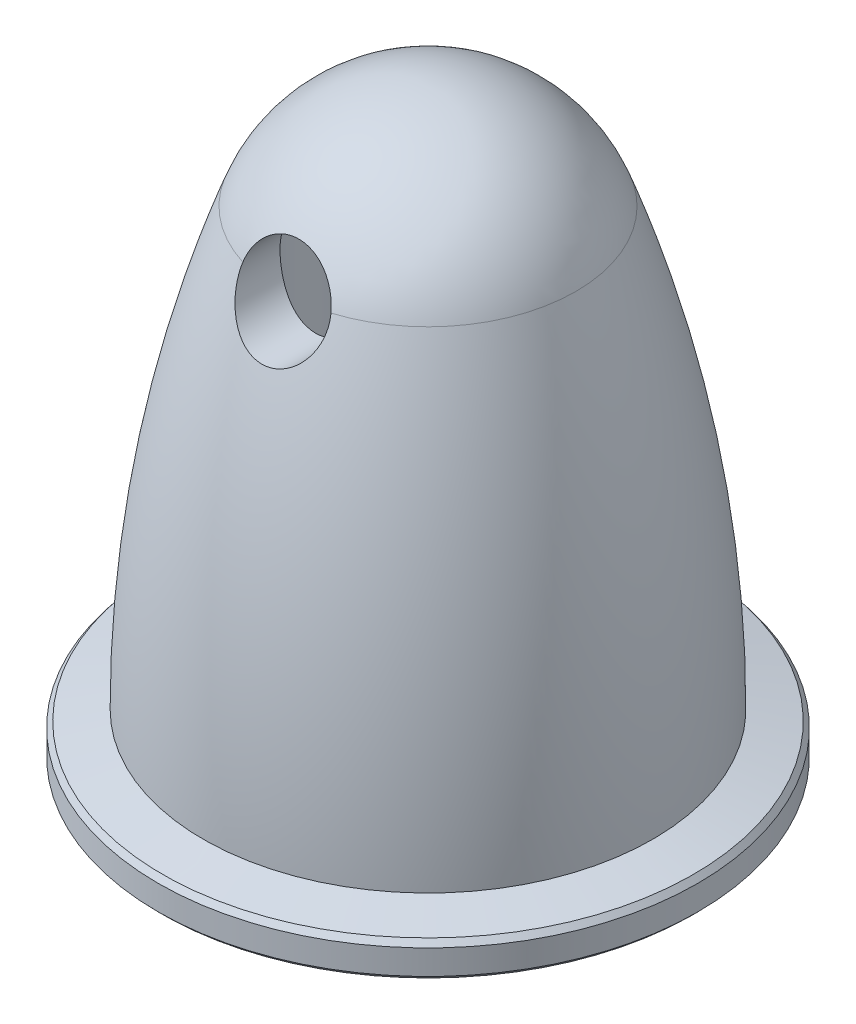
ISO-10303-21;
HEADER;
FILE_DESCRIPTION(('STEP AP214'),'2;1');
FILE_NAME('part.step','',(''),(''),'','','');
FILE_SCHEMA(('AUTOMOTIVE_DESIGN { 1 0 10303 214 1 1 1 1 }'));
ENDSEC;
DATA;
#1=APPLICATION_CONTEXT('core data for automotive mechanical design processes');
#2=APPLICATION_PROTOCOL_DEFINITION('international standard','automotive_design',2000,#1);
#3=PRODUCT_CONTEXT('',#1,'mechanical');
#4=PRODUCT('Part','Part','',(#3));
#5=PRODUCT_RELATED_PRODUCT_CATEGORY('part','',(#4));
#6=PRODUCT_DEFINITION_FORMATION('','',#4);
#7=PRODUCT_DEFINITION_CONTEXT('part definition',#1,'design');
#8=PRODUCT_DEFINITION('design','',#6,#7);
#9=PRODUCT_DEFINITION_SHAPE('','',#8);
#10=(LENGTH_UNIT() NAMED_UNIT(*) SI_UNIT(.MILLI.,.METRE.));
#11=(NAMED_UNIT(*) PLANE_ANGLE_UNIT() SI_UNIT($,.RADIAN.));
#12=(NAMED_UNIT(*) SI_UNIT($,.STERADIAN.) SOLID_ANGLE_UNIT());
#13=UNCERTAINTY_MEASURE_WITH_UNIT(LENGTH_MEASURE(1.E-05),#10,'distance_accuracy_value','');
#14=(GEOMETRIC_REPRESENTATION_CONTEXT(3) GLOBAL_UNCERTAINTY_ASSIGNED_CONTEXT((#13)) GLOBAL_UNIT_ASSIGNED_CONTEXT((#10,
#11,#12)) REPRESENTATION_CONTEXT('',''));
#15=CARTESIAN_POINT('',(0.,0.,0.));
#16=DIRECTION('',(0.,0.,1.));
#17=DIRECTION('',(1.,0.,0.));
#18=AXIS2_PLACEMENT_3D('',#15,#16,#17);
#19=CARTESIAN_POINT('',(0.,1.,0.));
#20=DIRECTION('',(0.,-1.,0.));
#21=DIRECTION('',(0.,0.,-1.));
#22=AXIS2_PLACEMENT_3D('',#19,#20,#21);
#23=DEGENERATE_TOROIDAL_SURFACE('',#22,23.3333333333333,28.3333333333333,.F.);
#24=CARTESIAN_POINT('',(-0.9801643130747,10.6981865771812,-3.13904872299698));
#25=CARTESIAN_POINT('',(-0.992082165864464,10.6393453095916,-3.15773856038258));
#26=CARTESIAN_POINT('',(-0.998537567377883,10.5800705783703,-3.17814365135362));
#27=CARTESIAN_POINT('',(-1.00101183025111,10.4623832107852,-3.22138447880564));
#28=CARTESIAN_POINT('',(-0.997062775937913,10.4039684814241,-3.24421253507635));
#29=CARTESIAN_POINT('',(-0.979300057147627,10.2894537358907,-3.29138277254803));
#30=CARTESIAN_POINT('',(-0.965504494016743,10.2333496717876,-3.31572210064782));
#31=CARTESIAN_POINT('',(-0.92859587113452,10.1244791589299,-3.36493771689045));
#32=CARTESIAN_POINT('',(-0.905473286191802,10.0717161861802,-3.3898145292822));
#33=CARTESIAN_POINT('',(-0.848796493965392,9.96778986336193,-3.4404285157489));
#34=CARTESIAN_POINT('',(-0.814716343697065,9.91689548640334,-3.46613224584871));
#35=CARTESIAN_POINT('',(-0.737244865027408,9.82159097549659,-3.51553138460037));
#36=CARTESIAN_POINT('',(-0.693853927341564,9.77718056958812,-3.53922687746718));
#37=CARTESIAN_POINT('',(-0.599948412864383,9.69767057976324,-3.58246029288749));
#38=CARTESIAN_POINT('',(-0.549684096683314,9.66233335390124,-3.60210091096532));
#39=CARTESIAN_POINT('',(-0.442281198488128,9.60100177310645,-3.63661477246273));
#40=CARTESIAN_POINT('',(-0.385150971545725,9.57499621318231,-3.65149373110302));
#41=CARTESIAN_POINT('',(-0.273455339507679,9.53653861089263,-3.67364756047944));
#42=CARTESIAN_POINT('',(-0.219481484087649,9.52278714885107,-3.6816468280469));
#43=CARTESIAN_POINT('',(-0.10949797326955,9.50445525575651,-3.69233154444194));
#44=CARTESIAN_POINT('',(-0.0534901363723631,9.4998668283909,-3.69502162641661));
#45=CARTESIAN_POINT('',(0.0521181623852736,9.50012390862014,-3.69487183584818));
#46=CARTESIAN_POINT('',(0.101725781564948,9.5039596772191,-3.69262384315565));
#47=CARTESIAN_POINT('',(0.199459809903802,9.51884856686669,-3.68393993456397));
#48=CARTESIAN_POINT('',(0.247586314733544,9.52990122072152,-3.67750428975763));
#49=CARTESIAN_POINT('',(0.340744503028943,9.55858970405548,-3.66092924089532));
#50=CARTESIAN_POINT('',(0.385796155320421,9.57617705279279,-3.65081712408367));
#51=CARTESIAN_POINT('',(0.472246611794564,9.61723428040891,-3.6274620630342));
#52=CARTESIAN_POINT('',(0.513644350397718,9.64070586767647,-3.61421820961331));
#53=CARTESIAN_POINT('',(0.595682950729986,9.69513929849346,-3.58392450392749));
#54=CARTESIAN_POINT('',(0.635912056839517,9.72658841243753,-3.56663796715277));
#55=CARTESIAN_POINT('',(0.710636979024403,9.79462637774685,-3.52994426889806));
#56=CARTESIAN_POINT('',(0.74513018682927,9.83121755347068,-3.51053614928825));
#57=CARTESIAN_POINT('',(0.812014566294821,9.91365658731909,-3.46781736674034));
#58=CARTESIAN_POINT('',(0.843569676997206,9.96008977105201,-3.44432534306232));
#59=CARTESIAN_POINT('',(0.89842920163067,10.0573422100791,-3.39670167569315));
#60=CARTESIAN_POINT('',(0.92172606775987,10.1081654252558,-3.37256946842908));
#61=CARTESIAN_POINT('',(0.961257636411987,10.2177452859143,-3.32257616368589));
#62=CARTESIAN_POINT('',(0.976694745072119,10.276806879585,-3.29674883916485));
#63=CARTESIAN_POINT('',(0.996588928143539,10.3973839989778,-3.24679229374132));
#64=CARTESIAN_POINT('',(1.00106556872487,10.4588949523462,-3.22266012166442));
#65=CARTESIAN_POINT('',(0.999172674042205,10.5503053501794,-3.1890827993519));
#66=CARTESIAN_POINT('',(0.997244884244495,10.5799460196496,-3.17854640702062));
#67=CARTESIAN_POINT('',(0.990717053181848,10.6391597508737,-3.15821899542592));
#68=CARTESIAN_POINT('',(0.98611923310514,10.6687328483357,-3.14842736424677));
#69=CARTESIAN_POINT('',(0.9801643130747,10.6981865771812,-3.13904872299697));
#70=B_SPLINE_CURVE_WITH_KNOTS('',3,(#24,#25,#26,#27,#28,#29,#30,#31,#32,#33,#34,#35,#36,#37,#38,
#39,#40,#41,#42,#43,#44,#45,#46,#47,#48,#49,#50,#51,#52,#53,#54,#55,#56,#57,#58,#59,#60,#61,#62,
#63,#64,#65,#66,#67,#68,#69),.UNSPECIFIED.,.F.,.F.,(4,2,2,2,2,2,2,2,2,2,2,2,2,2,2,2,2,2,2,2,2,2,
4),(0.,0.188207080940665,0.375834465574143,0.563117810558757,0.750592904263904,
0.948909956489771,1.14721868821684,1.33962919300086,1.53180788173466,1.69964709417016,
1.86733977411173,2.01603736218547,2.16472532509534,2.3123315131729,2.45998060593227,
2.62106692627656,2.78222629786698,2.96404152689865,3.14602250403153,3.34394785240539,
3.54151961425232,3.63596357007722,3.73032907065004),.UNSPECIFIED.);
#71=CARTESIAN_POINT('',(-0.980204731296514,10.6979865771812,-3.13911242959496));
#72=VERTEX_POINT('',#71);
#73=CARTESIAN_POINT('',(0.980204731296514,10.6979865771812,-3.13911242959496));
#74=VERTEX_POINT('',#73);
#75=EDGE_CURVE('E45',#72,#74,#70,.T.);
#76=ORIENTED_EDGE('',*,*,#75,.T.);
#77=CARTESIAN_POINT('',(0.,10.6979865771812,0.));
#78=DIRECTION('',(0.,-1.,0.));
#79=DIRECTION('',(0.,0.,-1.));
#80=AXIS2_PLACEMENT_3D('',#77,#78,#79);
#81=CIRCLE('',#80,3.28859060402684);
#82=CARTESIAN_POINT('',(0.980204731296514,10.6979865771812,3.13911242959496));
#83=VERTEX_POINT('',#82);
#84=EDGE_CURVE('E39',#74,#83,#81,.T.);
#85=ORIENTED_EDGE('',*,*,#84,.T.);
#86=CARTESIAN_POINT('',(-0.980164313074701,10.6981865771812,3.13904872299698));
#87=CARTESIAN_POINT('',(-0.992082165864465,10.6393453095916,3.15773856038258));
#88=CARTESIAN_POINT('',(-0.998537567377884,10.5800705783703,3.17814365135362));
#89=CARTESIAN_POINT('',(-1.00101183025111,10.4623832107852,3.22138447880564));
#90=CARTESIAN_POINT('',(-0.997062775937913,10.4039684814241,3.24421253507635));
#91=CARTESIAN_POINT('',(-0.979300057147626,10.2894537358907,3.29138277254803));
#92=CARTESIAN_POINT('',(-0.965504494016743,10.2333496717876,3.31572210064782));
#93=CARTESIAN_POINT('',(-0.928595871134519,10.1244791589299,3.36493771689045));
#94=CARTESIAN_POINT('',(-0.9054732861918,10.0717161861802,3.38981452928219));
#95=CARTESIAN_POINT('',(-0.848796493965389,9.96778986336192,3.4404285157489));
#96=CARTESIAN_POINT('',(-0.814716343697063,9.91689548640333,3.46613224584871));
#97=CARTESIAN_POINT('',(-0.737244865027407,9.82159097549659,3.51553138460037));
#98=CARTESIAN_POINT('',(-0.693853927341563,9.77718056958812,3.53922687746718));
#99=CARTESIAN_POINT('',(-0.599948412864381,9.69767057976324,3.5824602928875));
#100=CARTESIAN_POINT('',(-0.549684096683312,9.66233335390124,3.60210091096532));
#101=CARTESIAN_POINT('',(-0.442281198488124,9.60100177310644,3.63661477246273));
#102=CARTESIAN_POINT('',(-0.385150971545721,9.57499621318231,3.65149373110302));
#103=CARTESIAN_POINT('',(-0.273455339507675,9.53653861089263,3.67364756047944));
#104=CARTESIAN_POINT('',(-0.219481484087644,9.52278714885107,3.6816468280469));
#105=CARTESIAN_POINT('',(-0.109497973269545,9.50445525575651,3.69233154444194));
#106=CARTESIAN_POINT('',(-0.0534901363723588,9.4998668283909,3.69502162641661));
#107=CARTESIAN_POINT('',(0.0521181623852778,9.50012390862014,3.69487183584818));
#108=CARTESIAN_POINT('',(0.101725781564953,9.5039596772191,3.69262384315565));
#109=CARTESIAN_POINT('',(0.199459809903807,9.51884856686669,3.68393993456397));
#110=CARTESIAN_POINT('',(0.247586314733548,9.52990122072153,3.67750428975762));
#111=CARTESIAN_POINT('',(0.340744503028946,9.55858970405548,3.66092924089531));
#112=CARTESIAN_POINT('',(0.385796155320424,9.57617705279279,3.65081712408367));
#113=CARTESIAN_POINT('',(0.472246611794567,9.61723428040892,3.6274620630342));
#114=CARTESIAN_POINT('',(0.513644350397721,9.64070586767647,3.61421820961331));
#115=CARTESIAN_POINT('',(0.595682950729989,9.69513929849346,3.5839245039275));
#116=CARTESIAN_POINT('',(0.63591205683952,9.72658841243754,3.56663796715278));
#117=CARTESIAN_POINT('',(0.710636979024406,9.79462637774685,3.52994426889806));
#118=CARTESIAN_POINT('',(0.745130186829273,9.83121755347069,3.51053614928825));
#119=CARTESIAN_POINT('',(0.812014566294823,9.9136565873191,3.46781736674034));
#120=CARTESIAN_POINT('',(0.843569676997208,9.96008977105202,3.44432534306232));
#121=CARTESIAN_POINT('',(0.898429201630672,10.0573422100792,3.39670167569315));
#122=CARTESIAN_POINT('',(0.921726067759872,10.1081654252558,3.37256946842908));
#123=CARTESIAN_POINT('',(0.961257636411988,10.2177452859143,3.32257616368589));
#124=CARTESIAN_POINT('',(0.97669474507212,10.276806879585,3.29674883916485));
#125=CARTESIAN_POINT('',(0.996588928143539,10.3973839989778,3.24679229374132));
#126=CARTESIAN_POINT('',(1.00106556872487,10.4588949523462,3.22266012166441));
#127=CARTESIAN_POINT('',(0.999172674042205,10.5503053501794,3.18908279935189));
#128=CARTESIAN_POINT('',(0.997244884244495,10.5799460196496,3.17854640702062));
#129=CARTESIAN_POINT('',(0.990717053181848,10.6391597508737,3.15821899542592));
#130=CARTESIAN_POINT('',(0.98611923310514,10.6687328483357,3.14842736424677));
#131=CARTESIAN_POINT('',(0.980164313074701,10.6981865771812,3.13904872299698));
#132=B_SPLINE_CURVE_WITH_KNOTS('',3,(#86,#87,#88,#89,#90,#91,#92,#93,#94,#95,#96,#97,#98,#99,
#100,#101,#102,#103,#104,#105,#106,#107,#108,#109,#110,#111,#112,#113,#114,#115,#116,#117,#118,
#119,#120,#121,#122,#123,#124,#125,#126,#127,#128,#129,#130,#131),.UNSPECIFIED.,.F.,.F.,(4,2,2,
2,2,2,2,2,2,2,2,2,2,2,2,2,2,2,2,2,2,2,4),(0.,0.188207080940667,0.375834465574145,
0.563117810558758,0.750592904263907,0.948909956489771,1.14721868821684,1.33962919300087,
1.53180788173467,1.69964709417017,1.86733977411174,2.01603736218548,2.16472532509535,
2.3123315131729,2.45998060593227,2.62106692627657,2.78222629786698,2.96404152689866,
3.14602250403153,3.34394785240539,3.54151961425232,3.63596357007722,3.73032907065004),.UNSPECIFIED.);
#133=CARTESIAN_POINT('',(-0.980204731296514,10.6979865771812,3.13911242959496));
#134=VERTEX_POINT('',#133);
#135=EDGE_CURVE('E114',#134,#83,#132,.T.);
#136=ORIENTED_EDGE('',*,*,#135,.F.);
#137=EDGE_CURVE('E11',#134,#72,#81,.T.);
#138=ORIENTED_EDGE('',*,*,#137,.T.);
#139=EDGE_LOOP('',(#76,#85,#136,#138));
#140=FACE_BOUND('',#139,.T.);
#141=CARTESIAN_POINT('',(0.,1.,0.));
#142=DIRECTION('',(0.,-1.,0.));
#143=DIRECTION('',(0.,0.,-1.));
#144=AXIS2_PLACEMENT_3D('',#141,#142,#143);
#145=CIRCLE('',#144,5.);
#146=CARTESIAN_POINT('',(0.,1.,-5.));
#147=VERTEX_POINT('',#146);
#148=EDGE_CURVE('E111',#147,#147,#145,.T.);
#149=ORIENTED_EDGE('',*,*,#148,.F.);
#150=EDGE_LOOP('',(#149));
#151=FACE_BOUND('',#150,.T.);
#152=ADVANCED_FACE('F32',(#140,#151),#23,.F.);
#153=CARTESIAN_POINT('',(0.,9.5,0.));
#154=DIRECTION('',(0.,-1.,0.));
#155=DIRECTION('',(1.,0.,0.));
#156=AXIS2_PLACEMENT_3D('',#153,#154,#155);
#157=SPHERICAL_SURFACE('',#156,3.5);
#158=CARTESIAN_POINT('',(0.980245107045654,10.6977865771812,-3.13917614122521));
#159=CARTESIAN_POINT('',(0.968852237943741,10.7544386248826,-3.12113558879562));
#160=CARTESIAN_POINT('',(0.952466895786107,10.8101391899172,-3.10323025675369));
#161=CARTESIAN_POINT('',(0.910210813513384,10.9181682376535,-3.06821773098663));
#162=CARTESIAN_POINT('',(0.884328694539177,10.9704925862333,-3.05111152259002));
#163=CARTESIAN_POINT('',(0.823572665724106,11.0702153261289,-3.01825157067155));
#164=CARTESIAN_POINT('',(0.788688175741504,11.1176078286414,-3.00249944779192));
#165=CARTESIAN_POINT('',(0.710800478458026,11.205847415003,-2.97296530619078));
#166=CARTESIAN_POINT('',(0.667803407358088,11.2466994030786,-2.95918181219142));
#167=CARTESIAN_POINT('',(0.576251079189582,11.3192928793724,-2.93454629271452));
#168=CARTESIAN_POINT('',(0.527910969623835,11.3512787503073,-2.92361625373635));
#169=CARTESIAN_POINT('',(0.425976835832818,11.4065887234717,-2.90463649566655));
#170=CARTESIAN_POINT('',(0.37238350153275,11.4299139612123,-2.89658639898556));
#171=CARTESIAN_POINT('',(0.26456655234168,11.4659510771048,-2.88411770409719));
#172=CARTESIAN_POINT('',(0.210530020907756,11.4791639638708,-2.87952787694232));
#173=CARTESIAN_POINT('',(0.100849817250007,11.4964479914392,-2.87351933239727));
#174=CARTESIAN_POINT('',(0.0452066957480957,11.5005222280598,-2.87209954112337));
#175=CARTESIAN_POINT('',(-0.0638371764819372,11.4993920951091,-2.87249293544999));
#176=CARTESIAN_POINT('',(-0.11724237911833,11.4945362675807,-2.87418467761866));
#177=CARTESIAN_POINT('',(-0.22242388737002,11.4764094007266,-2.88048449917688));
#178=CARTESIAN_POINT('',(-0.274200213513293,11.4631384674972,-2.88509254179817));
#179=CARTESIAN_POINT('',(-0.374670662307187,11.4286772176777,-2.89701237421307));
#180=CARTESIAN_POINT('',(-0.423366644051968,11.4074917321602,-2.90432251460725));
#181=CARTESIAN_POINT('',(-0.516477726976704,11.3579239578044,-2.92133944316426));
#182=CARTESIAN_POINT('',(-0.560892591043462,11.3295412706589,-2.93104636396882));
#183=CARTESIAN_POINT('',(-0.645896182967318,11.2653456412352,-2.95286835918657));
#184=CARTESIAN_POINT('',(-0.686294742136534,11.2293059645717,-2.96505628659545));
#185=CARTESIAN_POINT('',(-0.760533784317838,11.1515224887183,-2.99117458422844));
#186=CARTESIAN_POINT('',(-0.794369965590642,11.1097749783162,-3.00510608761631));
#187=CARTESIAN_POINT('',(-0.85635797962837,11.0194305606219,-3.03502457502933));
#188=CARTESIAN_POINT('',(-0.884120297555783,10.9705897098645,-3.05108093267212));
#189=CARTESIAN_POINT('',(-0.930983132070554,10.8692909726191,-3.08410262536512));
#190=CARTESIAN_POINT('',(-0.950097734540904,10.8168391296891,-3.10106643153346));
#191=CARTESIAN_POINT('',(-0.970634052711348,10.7416149629956,-3.12519117387291));
#192=CARTESIAN_POINT('',(-0.97581380407461,10.7197667297425,-3.13217472092737));
#193=CARTESIAN_POINT('',(-0.980245107045675,10.6977865771812,-3.13917614122521));
#194=B_SPLINE_CURVE_WITH_KNOTS('',3,(#158,#159,#160,#161,#162,#163,#164,#165,#166,#167,#168,
#169,#170,#171,#172,#173,#174,#175,#176,#177,#178,#179,#180,#181,#182,#183,#184,#185,#186,#187,
#188,#189,#190,#191,#192,#193),.UNSPECIFIED.,.F.,.F.,(4,2,2,2,2,2,2,2,2,2,2,2,2,2,2,2,2,4),(0.,
0.181421656508885,0.363061402675684,0.5449156030663,0.726632799877624,0.902683131790459,
1.07871037327058,1.24532109978711,1.41187537656141,1.57206645204417,1.73225550790365,
1.89234694309658,2.05244723999555,2.21819358363606,2.38404821202027,2.55857113232507,
2.73280874730557,2.8032997742812),.UNSPECIFIED.);
#195=EDGE_CURVE('E86',#74,#72,#194,.T.);
#196=ORIENTED_EDGE('',*,*,#195,.T.);
#197=ORIENTED_EDGE('',*,*,#137,.F.);
#198=CARTESIAN_POINT('',(0.980245107045654,10.6977865771812,3.13917614122521));
#199=CARTESIAN_POINT('',(0.968852237943741,10.7544386248826,3.12113558879562));
#200=CARTESIAN_POINT('',(0.952466895786107,10.8101391899172,3.10323025675369));
#201=CARTESIAN_POINT('',(0.910210813513384,10.9181682376535,3.06821773098663));
#202=CARTESIAN_POINT('',(0.884328694539177,10.9704925862333,3.05111152259002));
#203=CARTESIAN_POINT('',(0.823572665724106,11.0702153261289,3.01825157067155));
#204=CARTESIAN_POINT('',(0.788688175741504,11.1176078286414,3.00249944779192));
#205=CARTESIAN_POINT('',(0.710800478458026,11.205847415003,2.97296530619078));
#206=CARTESIAN_POINT('',(0.667803407358088,11.2466994030786,2.95918181219142));
#207=CARTESIAN_POINT('',(0.576251079189582,11.3192928793724,2.93454629271452));
#208=CARTESIAN_POINT('',(0.527910969623835,11.3512787503073,2.92361625373635));
#209=CARTESIAN_POINT('',(0.425976835832818,11.4065887234717,2.90463649566655));
#210=CARTESIAN_POINT('',(0.37238350153275,11.4299139612123,2.89658639898556));
#211=CARTESIAN_POINT('',(0.26456655234168,11.4659510771048,2.88411770409719));
#212=CARTESIAN_POINT('',(0.210530020907756,11.4791639638708,2.87952787694232));
#213=CARTESIAN_POINT('',(0.100849817250007,11.4964479914392,2.87351933239727));
#214=CARTESIAN_POINT('',(0.0452066957480957,11.5005222280598,2.87209954112337));
#215=CARTESIAN_POINT('',(-0.0638371764819372,11.4993920951091,2.87249293544999));
#216=CARTESIAN_POINT('',(-0.11724237911833,11.4945362675807,2.87418467761866));
#217=CARTESIAN_POINT('',(-0.22242388737002,11.4764094007266,2.88048449917688));
#218=CARTESIAN_POINT('',(-0.274200213513293,11.4631384674972,2.88509254179817));
#219=CARTESIAN_POINT('',(-0.374670662307187,11.4286772176777,2.89701237421307));
#220=CARTESIAN_POINT('',(-0.423366644051968,11.4074917321602,2.90432251460725));
#221=CARTESIAN_POINT('',(-0.516477726976704,11.3579239578044,2.92133944316426));
#222=CARTESIAN_POINT('',(-0.560892591043462,11.3295412706589,2.93104636396882));
#223=CARTESIAN_POINT('',(-0.645896182967318,11.2653456412352,2.95286835918657));
#224=CARTESIAN_POINT('',(-0.686294742136534,11.2293059645717,2.96505628659545));
#225=CARTESIAN_POINT('',(-0.760533784317838,11.1515224887183,2.99117458422844));
#226=CARTESIAN_POINT('',(-0.794369965590642,11.1097749783162,3.00510608761631));
#227=CARTESIAN_POINT('',(-0.85635797962837,11.0194305606219,3.03502457502933));
#228=CARTESIAN_POINT('',(-0.884120297555783,10.9705897098645,3.05108093267212));
#229=CARTESIAN_POINT('',(-0.930983132070554,10.8692909726191,3.08410262536512));
#230=CARTESIAN_POINT('',(-0.950097734540904,10.8168391296891,3.10106643153346));
#231=CARTESIAN_POINT('',(-0.970634052711348,10.7416149629956,3.12519117387291));
#232=CARTESIAN_POINT('',(-0.97581380407461,10.7197667297425,3.13217472092737));
#233=CARTESIAN_POINT('',(-0.980245107045675,10.6977865771812,3.13917614122521));
#234=B_SPLINE_CURVE_WITH_KNOTS('',3,(#198,#199,#200,#201,#202,#203,#204,#205,#206,#207,#208,
#209,#210,#211,#212,#213,#214,#215,#216,#217,#218,#219,#220,#221,#222,#223,#224,#225,#226,#227,
#228,#229,#230,#231,#232,#233),.UNSPECIFIED.,.F.,.F.,(4,2,2,2,2,2,2,2,2,2,2,2,2,2,2,2,2,4),(0.,
0.181421656508885,0.363061402675684,0.5449156030663,0.726632799877624,0.902683131790459,
1.07871037327058,1.24532109978711,1.41187537656141,1.57206645204417,1.73225550790365,
1.89234694309658,2.05244723999555,2.21819358363606,2.38404821202027,2.55857113232507,
2.73280874730557,2.8032997742812),.UNSPECIFIED.);
#235=EDGE_CURVE('E122',#83,#134,#234,.T.);
#236=ORIENTED_EDGE('',*,*,#235,.F.);
#237=ORIENTED_EDGE('',*,*,#84,.F.);
#238=EDGE_LOOP('',(#196,#197,#236,#237));
#239=FACE_BOUND('',#238,.T.);
#240=ADVANCED_FACE('F179',(#239),#157,.T.);
#241=CARTESIAN_POINT('',(0.,11.75,0.));
#242=DIRECTION('',(0.,-1.,0.));
#243=DIRECTION('',(0.,0.,-1.));
#244=AXIS2_PLACEMENT_3D('',#241,#242,#243);
#245=CONICAL_SURFACE('',#244,0.,1.27933953231703);
#246=CARTESIAN_POINT('',(-0.893129307547348,10.9498,-2.51336172309342));
#247=CARTESIAN_POINT('',(-0.881746312422528,10.9723510028593,-2.43763735437326));
#248=CARTESIAN_POINT('',(-0.869329651510703,10.9949252611732,-2.3620591158089));
#249=CARTESIAN_POINT('',(-0.841979511589709,11.0401694145533,-2.21126388299205));
#250=CARTESIAN_POINT('',(-0.827042297665415,11.0628394021425,-2.13604759772466));
#251=CARTESIAN_POINT('',(-0.794241198841188,11.1082454908195,-1.98631006881687));
#252=CARTESIAN_POINT('',(-0.776378775666171,11.1309815533442,-1.9117884975862));
#253=CARTESIAN_POINT('',(-0.737026699315974,11.1765366539345,-1.76377219172537));
#254=CARTESIAN_POINT('',(-0.715539424546216,11.1993556280539,-1.69027681778552));
#255=CARTESIAN_POINT('',(-0.673111744382635,11.2399856185381,-1.56112525838647));
#256=CARTESIAN_POINT('',(-0.653123222760637,11.257775612134,-1.50515455236707));
#257=CARTESIAN_POINT('',(-0.609289052492457,11.2934546320148,-1.39452439633689));
#258=CARTESIAN_POINT('',(-0.585430738122785,11.3113437905793,-1.33986995297968));
#259=CARTESIAN_POINT('',(-0.532140825888767,11.3472804058916,-1.23243192075909));
#260=CARTESIAN_POINT('',(-0.50265045766139,11.3653274228775,-1.17967573855279));
#261=CARTESIAN_POINT('',(-0.45254013729488,11.3919394739549,-1.10442787251266));
#262=CARTESIAN_POINT('',(-0.434902170414326,11.4007151920007,-1.08004173060833));
#263=CARTESIAN_POINT('',(-0.397218520278627,11.4179588171768,-1.03310986275264));
#264=CARTESIAN_POINT('',(-0.377176397892471,11.4264271559233,-1.01056149601622));
#265=CARTESIAN_POINT('',(-0.336586965499849,11.4418738200225,-0.970438858417367));
#266=CARTESIAN_POINT('',(-0.316338641895571,11.4489135109396,-0.952590270532755));
#267=CARTESIAN_POINT('',(-0.273356462894879,11.4621751023853,-0.919781942549498));
#268=CARTESIAN_POINT('',(-0.25062408933343,11.4683974856442,-0.904820494732896));
#269=CARTESIAN_POINT('',(-0.202498278327597,11.4795963907339,-0.878534553400054));
#270=CARTESIAN_POINT('',(-0.177079464473197,11.4845591818743,-0.867249791564319));
#271=CARTESIAN_POINT('',(-0.124357939586778,11.4925942005241,-0.849306131281445));
#272=CARTESIAN_POINT('',(-0.0970558564498243,11.4956670547957,-0.84264569916758));
#273=CARTESIAN_POINT('',(-0.0440629971851077,11.4993496352658,-0.834708016258053));
#274=CARTESIAN_POINT('',(-0.0184501806453985,11.5001572055381,-0.832997922525624));
#275=CARTESIAN_POINT('',(0.0326940533439908,11.4997920719496,-0.833776958001954));
#276=CARTESIAN_POINT('',(0.0582254912139355,11.4986199117939,-0.83626493426964));
#277=CARTESIAN_POINT('',(0.106755599262209,11.4945644061968,-0.845046145654941));
#278=CARTESIAN_POINT('',(0.129811250368792,11.4917967107811,-0.851082700120035));
#279=CARTESIAN_POINT('',(0.174551685631812,11.4849084275058,-0.866474352907495));
#280=CARTESIAN_POINT('',(0.196236704041461,11.4807880715774,-0.875828882341942));
#281=CARTESIAN_POINT('',(0.245072593268821,11.4699300033209,-0.901142514109477));
#282=CARTESIAN_POINT('',(0.271525219166182,11.462779797765,-0.918266816183601));
#283=CARTESIAN_POINT('',(0.321127001497384,11.4473938482656,-0.956370414611847));
#284=CARTESIAN_POINT('',(0.344267790184654,11.439155452358,-0.977359179693447));
#285=CARTESIAN_POINT('',(0.403776336437903,11.4157690707484,-1.03860758426971));
#286=CARTESIAN_POINT('',(0.437110737356994,11.400057007356,-1.08155000498668));
#287=CARTESIAN_POINT('',(0.497413344047797,11.3681807254814,-1.17153631044518));
#288=CARTESIAN_POINT('',(0.524355361668341,11.3520149404336,-1.21859602157135));
#289=CARTESIAN_POINT('',(0.569694918929411,11.3222249023891,-1.30717061241996));
#290=CARTESIAN_POINT('',(0.588769609627268,11.3086130002698,-1.34834935242978));
#291=CARTESIAN_POINT('',(0.624440967694366,11.2813933205265,-1.43177715509381));
#292=CARTESIAN_POINT('',(0.641036420268839,11.2677855481637,-1.47402673066206));
#293=CARTESIAN_POINT('',(0.68794408451321,11.2269570010832,-1.6020206026713));
#294=CARTESIAN_POINT('',(0.715304552607898,11.1997820494947,-1.68885612922117));
#295=CARTESIAN_POINT('',(0.764618140596098,11.1455167116517,-1.86426385332695));
#296=CARTESIAN_POINT('',(0.786557546615223,11.1184267076288,-1.95283985559256));
#297=CARTESIAN_POINT('',(0.826190511999786,11.0643850719352,-2.13086589910025));
#298=CARTESIAN_POINT('',(0.843888526269704,11.0374333244344,-2.22031491965519));
#299=CARTESIAN_POINT('',(0.86588802310231,11.0003758953684,-2.34393114258991));
#300=CARTESIAN_POINT('',(0.87166827876598,10.9902322989194,-2.37783314315172));
#301=CARTESIAN_POINT('',(0.882746522478443,10.9699909589057,-2.4455992439223));
#302=CARTESIAN_POINT('',(0.888046103545,10.9598931777733,-2.47946307225685));
#303=CARTESIAN_POINT('',(0.893129307547332,10.9498,-2.51336172309344));
#304=B_SPLINE_CURVE_WITH_KNOTS('',3,(#246,#247,#248,#249,#250,#251,#252,#253,#254,#255,#256,
#257,#258,#259,#260,#261,#262,#263,#264,#265,#266,#267,#268,#269,#270,#271,#272,#273,#274,#275,
#276,#277,#278,#279,#280,#281,#282,#283,#284,#285,#286,#287,#288,#289,#290,#291,#292,#293,#294,
#295,#296,#297,#298,#299,#300,#301,#302,#303),.UNSPECIFIED.,.F.,.F.,(4,2,2,2,2,2,2,2,2,2,2,2,2,
2,2,2,2,2,2,2,2,2,2,2,2,2,2,2,4),(0.,0.239496267549471,0.479350584299942,0.71908540970918,
0.958663543307556,1.14467556617267,1.33130916408905,1.52000871564024,1.61395158653288,
1.70775699500999,1.7912265265388,1.87464653421614,1.95894021717654,2.04320593062401,
2.11984124722044,2.19645552042697,2.26811163404687,2.33975546770442,2.43613832160271,
2.53276055428313,2.70156472786193,2.87104895338405,3.01308778919742,3.15519599553803,
3.43994378167515,3.72540469562031,4.01056445133495,4.11813053943714,4.22532601227111),.UNSPECIFIED.);
#305=CARTESIAN_POINT('',(-0.86602540378444,11.,-2.34520787991171));
#306=VERTEX_POINT('',#305);
#307=CARTESIAN_POINT('',(0.86602540378444,11.,-2.34520787991171));
#308=VERTEX_POINT('',#307);
#309=EDGE_CURVE('E52',#306,#308,#304,.T.);
#310=ORIENTED_EDGE('',*,*,#309,.T.);
#311=CARTESIAN_POINT('',(0.,11.,0.));
#312=DIRECTION('',(0.,-1.,0.));
#313=DIRECTION('',(0.,0.,-1.));
#314=AXIS2_PLACEMENT_3D('',#311,#312,#313);
#315=CIRCLE('',#314,2.5);
#316=CARTESIAN_POINT('',(0.86602540378444,11.,2.34520787991171));
#317=VERTEX_POINT('',#316);
#318=EDGE_CURVE('E83',#308,#317,#315,.T.);
#319=ORIENTED_EDGE('',*,*,#318,.T.);
#320=CARTESIAN_POINT('',(-0.893129307547348,10.9498,2.51336172309342));
#321=CARTESIAN_POINT('',(-0.881746312422528,10.9723510028593,2.43763735437326));
#322=CARTESIAN_POINT('',(-0.869329651510703,10.9949252611732,2.3620591158089));
#323=CARTESIAN_POINT('',(-0.841979511589709,11.0401694145533,2.21126388299205));
#324=CARTESIAN_POINT('',(-0.827042297665415,11.0628394021425,2.13604759772466));
#325=CARTESIAN_POINT('',(-0.794241198841188,11.1082454908195,1.98631006881687));
#326=CARTESIAN_POINT('',(-0.776378775666171,11.1309815533442,1.9117884975862));
#327=CARTESIAN_POINT('',(-0.737026699315974,11.1765366539345,1.76377219172537));
#328=CARTESIAN_POINT('',(-0.715539424546216,11.1993556280539,1.69027681778552));
#329=CARTESIAN_POINT('',(-0.673111744382635,11.2399856185381,1.56112525838647));
#330=CARTESIAN_POINT('',(-0.653123222760637,11.257775612134,1.50515455236707));
#331=CARTESIAN_POINT('',(-0.609289052492457,11.2934546320148,1.39452439633689));
#332=CARTESIAN_POINT('',(-0.585430738122785,11.3113437905793,1.33986995297968));
#333=CARTESIAN_POINT('',(-0.532140825888767,11.3472804058916,1.23243192075909));
#334=CARTESIAN_POINT('',(-0.50265045766139,11.3653274228775,1.17967573855279));
#335=CARTESIAN_POINT('',(-0.45254013729488,11.3919394739549,1.10442787251266));
#336=CARTESIAN_POINT('',(-0.434902170414326,11.4007151920007,1.08004173060833));
#337=CARTESIAN_POINT('',(-0.397218520278627,11.4179588171768,1.03310986275264));
#338=CARTESIAN_POINT('',(-0.377176397892471,11.4264271559233,1.01056149601622));
#339=CARTESIAN_POINT('',(-0.336586965499849,11.4418738200225,0.970438858417367));
#340=CARTESIAN_POINT('',(-0.316338641895571,11.4489135109396,0.952590270532755));
#341=CARTESIAN_POINT('',(-0.273356462894879,11.4621751023853,0.919781942549498));
#342=CARTESIAN_POINT('',(-0.25062408933343,11.4683974856442,0.904820494732896));
#343=CARTESIAN_POINT('',(-0.202498278327597,11.4795963907339,0.878534553400054));
#344=CARTESIAN_POINT('',(-0.177079464473197,11.4845591818743,0.867249791564319));
#345=CARTESIAN_POINT('',(-0.124357939586778,11.4925942005241,0.849306131281445));
#346=CARTESIAN_POINT('',(-0.0970558564498243,11.4956670547957,0.84264569916758));
#347=CARTESIAN_POINT('',(-0.0440629971851077,11.4993496352658,0.834708016258053));
#348=CARTESIAN_POINT('',(-0.0184501806453985,11.5001572055381,0.832997922525624));
#349=CARTESIAN_POINT('',(0.0326940533439908,11.4997920719496,0.833776958001954));
#350=CARTESIAN_POINT('',(0.0582254912139355,11.4986199117939,0.83626493426964));
#351=CARTESIAN_POINT('',(0.106755599262209,11.4945644061968,0.845046145654941));
#352=CARTESIAN_POINT('',(0.129811250368792,11.4917967107811,0.851082700120035));
#353=CARTESIAN_POINT('',(0.174551685631812,11.4849084275058,0.866474352907495));
#354=CARTESIAN_POINT('',(0.196236704041461,11.4807880715774,0.875828882341942));
#355=CARTESIAN_POINT('',(0.245072593268821,11.4699300033209,0.901142514109477));
#356=CARTESIAN_POINT('',(0.271525219166182,11.462779797765,0.918266816183601));
#357=CARTESIAN_POINT('',(0.321127001497384,11.4473938482656,0.956370414611847));
#358=CARTESIAN_POINT('',(0.344267790184654,11.439155452358,0.977359179693447));
#359=CARTESIAN_POINT('',(0.403776336437903,11.4157690707484,1.03860758426971));
#360=CARTESIAN_POINT('',(0.437110737356994,11.400057007356,1.08155000498668));
#361=CARTESIAN_POINT('',(0.497413344047797,11.3681807254814,1.17153631044518));
#362=CARTESIAN_POINT('',(0.524355361668341,11.3520149404336,1.21859602157135));
#363=CARTESIAN_POINT('',(0.569694918929411,11.3222249023891,1.30717061241996));
#364=CARTESIAN_POINT('',(0.588769609627268,11.3086130002698,1.34834935242978));
#365=CARTESIAN_POINT('',(0.624440967694366,11.2813933205265,1.43177715509381));
#366=CARTESIAN_POINT('',(0.641036420268839,11.2677855481637,1.47402673066206));
#367=CARTESIAN_POINT('',(0.68794408451321,11.2269570010832,1.6020206026713));
#368=CARTESIAN_POINT('',(0.715304552607898,11.1997820494947,1.68885612922117));
#369=CARTESIAN_POINT('',(0.764618140596098,11.1455167116517,1.86426385332695));
#370=CARTESIAN_POINT('',(0.786557546615223,11.1184267076288,1.95283985559256));
#371=CARTESIAN_POINT('',(0.826190511999786,11.0643850719352,2.13086589910025));
#372=CARTESIAN_POINT('',(0.843888526269704,11.0374333244344,2.22031491965519));
#373=CARTESIAN_POINT('',(0.86588802310231,11.0003758953684,2.34393114258991));
#374=CARTESIAN_POINT('',(0.87166827876598,10.9902322989194,2.37783314315172));
#375=CARTESIAN_POINT('',(0.882746522478443,10.9699909589057,2.4455992439223));
#376=CARTESIAN_POINT('',(0.888046103545,10.9598931777733,2.47946307225685));
#377=CARTESIAN_POINT('',(0.893129307547332,10.9498,2.51336172309344));
#378=B_SPLINE_CURVE_WITH_KNOTS('',3,(#320,#321,#322,#323,#324,#325,#326,#327,#328,#329,#330,
#331,#332,#333,#334,#335,#336,#337,#338,#339,#340,#341,#342,#343,#344,#345,#346,#347,#348,#349,
#350,#351,#352,#353,#354,#355,#356,#357,#358,#359,#360,#361,#362,#363,#364,#365,#366,#367,#368,
#369,#370,#371,#372,#373,#374,#375,#376,#377),.UNSPECIFIED.,.F.,.F.,(4,2,2,2,2,2,2,2,2,2,2,2,2,
2,2,2,2,2,2,2,2,2,2,2,2,2,2,2,4),(0.,0.239496267549471,0.479350584299942,0.71908540970918,
0.958663543307556,1.14467556617267,1.33130916408905,1.52000871564024,1.61395158653288,
1.70775699500999,1.7912265265388,1.87464653421614,1.95894021717654,2.04320593062401,
2.11984124722044,2.19645552042697,2.26811163404687,2.33975546770442,2.43613832160271,
2.53276055428313,2.70156472786193,2.87104895338405,3.01308778919742,3.15519599553803,
3.43994378167515,3.72540469562031,4.01056445133495,4.11813053943714,4.22532601227111),.UNSPECIFIED.);
#379=CARTESIAN_POINT('',(-0.86602540378444,11.,2.34520787991171));
#380=VERTEX_POINT('',#379);
#381=EDGE_CURVE('E138',#380,#317,#378,.T.);
#382=ORIENTED_EDGE('',*,*,#381,.F.);
#383=EDGE_CURVE('E85',#380,#306,#315,.T.);
#384=ORIENTED_EDGE('',*,*,#383,.T.);
#385=EDGE_LOOP('',(#310,#319,#382,#384));
#386=FACE_BOUND('',#385,.T.);
#387=CARTESIAN_POINT('',(0.,11.75,0.));
#388=VERTEX_POINT('',#387);
#389=VERTEX_LOOP('',#388);
#390=FACE_BOUND('',#389,.T.);
#391=ADVANCED_FACE('F80',(#386,#390),#245,.F.);
#392=CARTESIAN_POINT('',(0.,11.75,0.));
#393=DIRECTION('',(0.,-1.,0.));
#394=DIRECTION('',(0.,0.,-1.));
#395=AXIS2_PLACEMENT_3D('',#392,#393,#394);
#396=CYLINDRICAL_SURFACE('',#395,2.5);
#397=CARTESIAN_POINT('',(0.86602540378444,11.,-2.34520787991171));
#398=CARTESIAN_POINT('',(0.892444265115744,10.9543284863216,-2.33542283276053));
#399=CARTESIAN_POINT('',(0.915279342036734,10.9063395263562,-2.32650845918934));
#400=CARTESIAN_POINT('',(0.953199053622602,10.806954549832,-2.31124838782977));
#401=CARTESIAN_POINT('',(0.96827513083046,10.7555548417408,-2.30490552781118));
#402=CARTESIAN_POINT('',(0.990060960514951,10.6505483310237,-2.29562919344368));
#403=CARTESIAN_POINT('',(0.99674922670936,10.5969362220682,-2.29270447633459));
#404=CARTESIAN_POINT('',(1.0013895155303,10.4893283464373,-2.2906830872204));
#405=CARTESIAN_POINT('',(0.999352546500735,10.4353331489574,-2.29158159157236));
#406=CARTESIAN_POINT('',(0.986905227891692,10.3306068837384,-2.29696724449037));
#407=CARTESIAN_POINT('',(0.976816448223526,10.2798297915973,-2.30131653843295));
#408=CARTESIAN_POINT('',(0.949057707412856,10.1807179494419,-2.31290156803472));
#409=CARTESIAN_POINT('',(0.931382565320823,10.1323848937929,-2.32013927603906));
#410=CARTESIAN_POINT('',(0.888340320231311,10.037788981702,-2.33696379216636));
#411=CARTESIAN_POINT('',(0.862743385803585,9.99164327654612,-2.34661887388761));
#412=CARTESIAN_POINT('',(0.804785221087949,9.90411565095289,-2.36712150340343));
#413=CARTESIAN_POINT('',(0.772422332819032,9.86273490201842,-2.37796934317108));
#414=CARTESIAN_POINT('',(0.698946246789226,9.7826100766689,-2.40063736143936));
#415=CARTESIAN_POINT('',(0.657354442591077,9.74430659518194,-2.41246869003708));
#416=CARTESIAN_POINT('',(0.568118000995779,9.67511841766808,-2.43502729132876));
#417=CARTESIAN_POINT('',(0.520472418552203,9.64423488213883,-2.4457543911689));
#418=CARTESIAN_POINT('',(0.419830110650981,9.5905933521031,-2.46503284585287));
#419=CARTESIAN_POINT('',(0.366790460242217,9.56790834198203,-2.47356447216065));
#420=CARTESIAN_POINT('',(0.257218389623899,9.53193035962606,-2.48734400954681));
#421=CARTESIAN_POINT('',(0.200687886984397,9.51863228006858,-2.49259370610788));
#422=CARTESIAN_POINT('',(0.0895853061520504,9.50254111992961,-2.49897461940092));
#423=CARTESIAN_POINT('',(0.0351150521444091,9.49913757916812,-2.50034502237612));
#424=CARTESIAN_POINT('',(-0.073619660169774,9.50123310624934,-2.49950671502258));
#425=CARTESIAN_POINT('',(-0.127884157171028,9.50673040751668,-2.49729871490955));
#426=CARTESIAN_POINT('',(-0.23256098344445,9.52601688051143,-2.48969265912313));
#427=CARTESIAN_POINT('',(-0.283041489609193,9.53948862258788,-2.48441685514632));
#428=CARTESIAN_POINT('',(-0.380998531477268,9.57396669178808,-2.47129205997148));
#429=CARTESIAN_POINT('',(-0.428474570760473,9.59497426023257,-2.4634426448599));
#430=CARTESIAN_POINT('',(-0.521097255730348,9.64482196647295,-2.44556098334505));
#431=CARTESIAN_POINT('',(-0.566084301313454,9.67393204900812,-2.4354564522943));
#432=CARTESIAN_POINT('',(-0.650711162824328,9.73880338569078,-2.41422485692531));
#433=CARTESIAN_POINT('',(-0.69034884479887,9.7745672807062,-2.40309738749769));
#434=CARTESIAN_POINT('',(-0.765806795384077,9.85443952074214,-2.38016686540774));
#435=CARTESIAN_POINT('',(-0.801217779526323,9.89893652456279,-2.3683663743409));
#436=CARTESIAN_POINT('',(-0.864132771671861,9.99354031925408,-2.34614394414841));
#437=CARTESIAN_POINT('',(-0.891635496557605,10.0436480186314,-2.3357222288775));
#438=CARTESIAN_POINT('',(-0.937806093223839,10.1481790538874,-2.31757160026268));
#439=CARTESIAN_POINT('',(-0.956485577726381,10.2025966065103,-2.3098391509937));
#440=CARTESIAN_POINT('',(-0.984260750188307,10.3141811839655,-2.29814345296523));
#441=CARTESIAN_POINT('',(-0.99336689618159,10.3713451370339,-2.29417609163904));
#442=CARTESIAN_POINT('',(-1.00126448577622,10.4821476428285,-2.29073895900483));
#443=CARTESIAN_POINT('',(-1.00078457477087,10.5357254879715,-2.29095145283242));
#444=CARTESIAN_POINT('',(-0.99130119512151,10.6420223264,-2.2950701654052));
#445=CARTESIAN_POINT('',(-0.982291242523671,10.6947406353135,-2.29897919400052));
#446=CARTESIAN_POINT('',(-0.957855754528612,10.7909321755561,-2.30925616765939));
#447=CARTESIAN_POINT('',(-0.94343186479681,10.8347083595773,-2.31523229838284));
#448=CARTESIAN_POINT('',(-0.908889793833105,10.9195491867365,-2.32900117416463));
#449=CARTESIAN_POINT('',(-0.888783310361928,10.960619188651,-2.33679018161801));
#450=CARTESIAN_POINT('',(-0.86602540378444,11.,-2.34520787991171));
#451=B_SPLINE_CURVE_WITH_KNOTS('',3,(#397,#398,#399,#400,#401,#402,#403,#404,#405,#406,#407,
#408,#409,#410,#411,#412,#413,#414,#415,#416,#417,#418,#419,#420,#421,#422,#423,#424,#425,#426,
#427,#428,#429,#430,#431,#432,#433,#434,#435,#436,#437,#438,#439,#440,#441,#442,#443,#444,#445,
#446,#447,#448,#449,#450),.UNSPECIFIED.,.F.,.F.,(4,2,2,2,2,2,2,2,2,2,2,2,2,2,2,2,2,2,2,2,2,2,2,
2,2,2,4),(0.,0.160894236665709,0.321965546508982,0.483448620666236,0.644728016960931,
0.799870474045334,0.955119051471265,1.11537792497438,1.27567611566283,1.44817837186857,
1.62070759031041,1.79473690883071,1.96867146683394,2.13162006288087,2.2945363220221,
2.45136654631894,2.60822261596635,2.77110576732539,2.93405370471504,3.1074781560465,
3.28093072969283,3.45415437292905,3.62718858724908,3.78712401277499,3.94718110795776,
4.08615072981069,4.22483633720618),.UNSPECIFIED.);
#452=EDGE_CURVE('E72',#308,#306,#451,.T.);
#453=ORIENTED_EDGE('',*,*,#452,.T.);
#454=ORIENTED_EDGE('',*,*,#383,.F.);
#455=CARTESIAN_POINT('',(0.86602540378444,11.,2.34520787991171));
#456=CARTESIAN_POINT('',(0.892444265115744,10.9543284863216,2.33542283276053));
#457=CARTESIAN_POINT('',(0.915279342036734,10.9063395263562,2.32650845918934));
#458=CARTESIAN_POINT('',(0.953199053622602,10.806954549832,2.31124838782977));
#459=CARTESIAN_POINT('',(0.96827513083046,10.7555548417408,2.30490552781118));
#460=CARTESIAN_POINT('',(0.990060960514951,10.6505483310237,2.29562919344368));
#461=CARTESIAN_POINT('',(0.99674922670936,10.5969362220682,2.29270447633459));
#462=CARTESIAN_POINT('',(1.0013895155303,10.4893283464373,2.2906830872204));
#463=CARTESIAN_POINT('',(0.999352546500735,10.4353331489574,2.29158159157236));
#464=CARTESIAN_POINT('',(0.986905227891692,10.3306068837384,2.29696724449037));
#465=CARTESIAN_POINT('',(0.976816448223526,10.2798297915973,2.30131653843295));
#466=CARTESIAN_POINT('',(0.949057707412856,10.1807179494419,2.31290156803472));
#467=CARTESIAN_POINT('',(0.931382565320823,10.1323848937929,2.32013927603906));
#468=CARTESIAN_POINT('',(0.888340320231311,10.037788981702,2.33696379216636));
#469=CARTESIAN_POINT('',(0.862743385803585,9.99164327654612,2.34661887388761));
#470=CARTESIAN_POINT('',(0.804785221087949,9.90411565095289,2.36712150340343));
#471=CARTESIAN_POINT('',(0.772422332819032,9.86273490201842,2.37796934317108));
#472=CARTESIAN_POINT('',(0.698946246789226,9.7826100766689,2.40063736143936));
#473=CARTESIAN_POINT('',(0.657354442591077,9.74430659518194,2.41246869003708));
#474=CARTESIAN_POINT('',(0.568118000995779,9.67511841766808,2.43502729132876));
#475=CARTESIAN_POINT('',(0.520472418552203,9.64423488213883,2.4457543911689));
#476=CARTESIAN_POINT('',(0.419830110650981,9.5905933521031,2.46503284585287));
#477=CARTESIAN_POINT('',(0.366790460242217,9.56790834198203,2.47356447216065));
#478=CARTESIAN_POINT('',(0.257218389623899,9.53193035962606,2.48734400954681));
#479=CARTESIAN_POINT('',(0.200687886984397,9.51863228006858,2.49259370610788));
#480=CARTESIAN_POINT('',(0.0895853061520504,9.50254111992961,2.49897461940092));
#481=CARTESIAN_POINT('',(0.0351150521444091,9.49913757916812,2.50034502237612));
#482=CARTESIAN_POINT('',(-0.073619660169774,9.50123310624934,2.49950671502258));
#483=CARTESIAN_POINT('',(-0.127884157171028,9.50673040751668,2.49729871490955));
#484=CARTESIAN_POINT('',(-0.23256098344445,9.52601688051143,2.48969265912313));
#485=CARTESIAN_POINT('',(-0.283041489609193,9.53948862258788,2.48441685514632));
#486=CARTESIAN_POINT('',(-0.380998531477268,9.57396669178808,2.47129205997148));
#487=CARTESIAN_POINT('',(-0.428474570760473,9.59497426023257,2.4634426448599));
#488=CARTESIAN_POINT('',(-0.521097255730348,9.64482196647295,2.44556098334505));
#489=CARTESIAN_POINT('',(-0.566084301313454,9.67393204900812,2.4354564522943));
#490=CARTESIAN_POINT('',(-0.650711162824328,9.73880338569078,2.41422485692531));
#491=CARTESIAN_POINT('',(-0.69034884479887,9.7745672807062,2.40309738749769));
#492=CARTESIAN_POINT('',(-0.765806795384077,9.85443952074214,2.38016686540774));
#493=CARTESIAN_POINT('',(-0.801217779526323,9.89893652456279,2.3683663743409));
#494=CARTESIAN_POINT('',(-0.864132771671861,9.99354031925408,2.34614394414841));
#495=CARTESIAN_POINT('',(-0.891635496557605,10.0436480186314,2.3357222288775));
#496=CARTESIAN_POINT('',(-0.937806093223839,10.1481790538874,2.31757160026268));
#497=CARTESIAN_POINT('',(-0.956485577726381,10.2025966065103,2.3098391509937));
#498=CARTESIAN_POINT('',(-0.984260750188307,10.3141811839655,2.29814345296523));
#499=CARTESIAN_POINT('',(-0.99336689618159,10.3713451370339,2.29417609163904));
#500=CARTESIAN_POINT('',(-1.00126448577622,10.4821476428285,2.29073895900483));
#501=CARTESIAN_POINT('',(-1.00078457477087,10.5357254879715,2.29095145283242));
#502=CARTESIAN_POINT('',(-0.99130119512151,10.6420223264,2.2950701654052));
#503=CARTESIAN_POINT('',(-0.982291242523671,10.6947406353135,2.29897919400052));
#504=CARTESIAN_POINT('',(-0.957855754528612,10.7909321755561,2.30925616765939));
#505=CARTESIAN_POINT('',(-0.94343186479681,10.8347083595773,2.31523229838284));
#506=CARTESIAN_POINT('',(-0.908889793833105,10.9195491867365,2.32900117416463));
#507=CARTESIAN_POINT('',(-0.888783310361928,10.960619188651,2.33679018161801));
#508=CARTESIAN_POINT('',(-0.86602540378444,11.,2.34520787991171));
#509=B_SPLINE_CURVE_WITH_KNOTS('',3,(#455,#456,#457,#458,#459,#460,#461,#462,#463,#464,#465,
#466,#467,#468,#469,#470,#471,#472,#473,#474,#475,#476,#477,#478,#479,#480,#481,#482,#483,#484,
#485,#486,#487,#488,#489,#490,#491,#492,#493,#494,#495,#496,#497,#498,#499,#500,#501,#502,#503,
#504,#505,#506,#507,#508),.UNSPECIFIED.,.F.,.F.,(4,2,2,2,2,2,2,2,2,2,2,2,2,2,2,2,2,2,2,2,2,2,2,
2,2,2,4),(0.,0.160894236665709,0.321965546508982,0.483448620666236,0.644728016960931,
0.799870474045334,0.955119051471265,1.11537792497438,1.27567611566283,1.44817837186857,
1.62070759031041,1.79473690883071,1.96867146683394,2.13162006288087,2.2945363220221,
2.45136654631894,2.60822261596635,2.77110576732539,2.93405370471504,3.1074781560465,
3.28093072969283,3.45415437292905,3.62718858724908,3.78712401277499,3.94718110795776,
4.08615072981069,4.22483633720618),.UNSPECIFIED.);
#510=EDGE_CURVE('E91',#317,#380,#509,.T.);
#511=ORIENTED_EDGE('',*,*,#510,.F.);
#512=ORIENTED_EDGE('',*,*,#318,.F.);
#513=EDGE_LOOP('',(#453,#454,#511,#512));
#514=FACE_BOUND('',#513,.T.);
#515=CARTESIAN_POINT('',(0.,0.25,0.));
#516=DIRECTION('',(0.,-1.,0.));
#517=DIRECTION('',(0.,0.,-1.));
#518=AXIS2_PLACEMENT_3D('',#515,#516,#517);
#519=CIRCLE('',#518,2.5);
#520=CARTESIAN_POINT('',(0.,0.25,-2.5));
#521=VERTEX_POINT('',#520);
#522=EDGE_CURVE('E92',#521,#521,#519,.T.);
#523=ORIENTED_EDGE('',*,*,#522,.T.);
#524=EDGE_LOOP('',(#523));
#525=FACE_BOUND('',#524,.T.);
#526=ADVANCED_FACE('F89',(#514,#525),#396,.F.);
#527=CARTESIAN_POINT('',(0.,0.25,0.));
#528=DIRECTION('',(0.,-1.,0.));
#529=DIRECTION('',(0.,0.,-1.));
#530=AXIS2_PLACEMENT_3D('',#527,#528,#529);
#531=CONICAL_SURFACE('',#530,2.5,0.785398163397447);
#532=CARTESIAN_POINT('',(0.,0.,0.));
#533=DIRECTION('',(0.,-1.,0.));
#534=DIRECTION('',(0.,0.,-1.));
#535=AXIS2_PLACEMENT_3D('',#532,#533,#534);
#536=CIRCLE('',#535,2.75);
#537=CARTESIAN_POINT('',(0.,0.,-2.75));
#538=VERTEX_POINT('',#537);
#539=EDGE_CURVE('E94',#538,#538,#536,.T.);
#540=ORIENTED_EDGE('',*,*,#539,.T.);
#541=EDGE_LOOP('',(#540));
#542=FACE_BOUND('',#541,.T.);
#543=ORIENTED_EDGE('',*,*,#522,.F.);
#544=EDGE_LOOP('',(#543));
#545=FACE_BOUND('',#544,.T.);
#546=ADVANCED_FACE('F214',(#542,#545),#531,.F.);
#547=CARTESIAN_POINT('',(2.75,0.,0.));
#548=DIRECTION('',(0.,-1.,0.));
#549=DIRECTION('',(0.,0.,-1.));
#550=AXIS2_PLACEMENT_3D('',#547,#548,#549);
#551=PLANE('',#550);
#552=CARTESIAN_POINT('',(0.,0.,0.));
#553=DIRECTION('',(0.,-1.,0.));
#554=DIRECTION('',(0.,0.,-1.));
#555=AXIS2_PLACEMENT_3D('',#552,#553,#554);
#556=CIRCLE('',#555,5.9);
#557=CARTESIAN_POINT('',(0.,0.,-5.9));
#558=VERTEX_POINT('',#557);
#559=EDGE_CURVE('E99',#558,#558,#556,.T.);
#560=ORIENTED_EDGE('',*,*,#559,.T.);
#561=EDGE_LOOP('',(#560));
#562=FACE_BOUND('',#561,.T.);
#563=ORIENTED_EDGE('',*,*,#539,.F.);
#564=EDGE_LOOP('',(#563));
#565=FACE_BOUND('',#564,.T.);
#566=ADVANCED_FACE('F208',(#562,#565),#551,.T.);
#567=CARTESIAN_POINT('',(0.,0.,0.));
#568=DIRECTION('',(0.,1.,0.));
#569=DIRECTION('',(0.,0.,1.));
#570=AXIS2_PLACEMENT_3D('',#567,#568,#569);
#571=CONICAL_SURFACE('',#570,5.9,0.785398163397453);
#572=CARTESIAN_POINT('',(0.,0.0999999999999994,0.));
#573=DIRECTION('',(0.,-1.,0.));
#574=DIRECTION('',(0.,0.,-1.));
#575=AXIS2_PLACEMENT_3D('',#572,#573,#574);
#576=CIRCLE('',#575,6.);
#577=CARTESIAN_POINT('',(0.,0.0999999999999994,-6.));
#578=VERTEX_POINT('',#577);
#579=EDGE_CURVE('E102',#578,#578,#576,.T.);
#580=ORIENTED_EDGE('',*,*,#579,.T.);
#581=EDGE_LOOP('',(#580));
#582=FACE_BOUND('',#581,.T.);
#583=ORIENTED_EDGE('',*,*,#559,.F.);
#584=EDGE_LOOP('',(#583));
#585=FACE_BOUND('',#584,.T.);
#586=ADVANCED_FACE('F202',(#582,#585),#571,.T.);
#587=CARTESIAN_POINT('',(0.,11.75,0.));
#588=DIRECTION('',(0.,-1.,0.));
#589=DIRECTION('',(0.,0.,-1.));
#590=AXIS2_PLACEMENT_3D('',#587,#588,#589);
#591=CYLINDRICAL_SURFACE('',#590,6.);
#592=CARTESIAN_POINT('',(0.,0.65,0.));
#593=DIRECTION('',(0.,-1.,0.));
#594=DIRECTION('',(0.,0.,-1.));
#595=AXIS2_PLACEMENT_3D('',#592,#593,#594);
#596=CIRCLE('',#595,6.);
#597=CARTESIAN_POINT('',(0.,0.65,-6.));
#598=VERTEX_POINT('',#597);
#599=EDGE_CURVE('E105',#598,#598,#596,.T.);
#600=ORIENTED_EDGE('',*,*,#599,.T.);
#601=EDGE_LOOP('',(#600));
#602=FACE_BOUND('',#601,.T.);
#603=ORIENTED_EDGE('',*,*,#579,.F.);
#604=EDGE_LOOP('',(#603));
#605=FACE_BOUND('',#604,.T.);
#606=ADVANCED_FACE('F196',(#602,#605),#591,.T.);
#607=CARTESIAN_POINT('',(0.,0.65,0.));
#608=DIRECTION('',(0.,-1.,0.));
#609=DIRECTION('',(0.,0.,-1.));
#610=AXIS2_PLACEMENT_3D('',#607,#608,#609);
#611=CONICAL_SURFACE('',#610,6.,0.662908831834014);
#612=CARTESIAN_POINT('',(0.,0.774253562503633,0.));
#613=DIRECTION('',(0.,-1.,0.));
#614=DIRECTION('',(0.,0.,-1.));
#615=AXIS2_PLACEMENT_3D('',#612,#613,#614);
#616=CIRCLE('',#615,5.90298574998547);
#617=CARTESIAN_POINT('',(0.,0.774253562503633,-5.90298574998547));
#618=VERTEX_POINT('',#617);
#619=EDGE_CURVE('E108',#618,#618,#616,.T.);
#620=ORIENTED_EDGE('',*,*,#619,.T.);
#621=EDGE_LOOP('',(#620));
#622=FACE_BOUND('',#621,.T.);
#623=ORIENTED_EDGE('',*,*,#599,.F.);
#624=EDGE_LOOP('',(#623));
#625=FACE_BOUND('',#624,.T.);
#626=ADVANCED_FACE('F191',(#622,#625),#611,.T.);
#627=CARTESIAN_POINT('',(0.,0.774253562503633,0.));
#628=DIRECTION('',(0.,-1.,0.));
#629=DIRECTION('',(0.,0.,-1.));
#630=AXIS2_PLACEMENT_3D('',#627,#628,#629);
#631=CONICAL_SURFACE('',#630,5.90298574998547,1.32581766366803);
#632=ORIENTED_EDGE('',*,*,#148,.T.);
#633=EDGE_LOOP('',(#632));
#634=FACE_BOUND('',#633,.T.);
#635=ORIENTED_EDGE('',*,*,#619,.F.);
#636=EDGE_LOOP('',(#635));
#637=FACE_BOUND('',#636,.T.);
#638=ADVANCED_FACE('F176',(#634,#637),#631,.T.);
#639=CARTESIAN_POINT('',(0.,10.5,6.001));
#640=DIRECTION('',(0.,0.,-1.));
#641=DIRECTION('',(-1.,0.,0.));
#642=AXIS2_PLACEMENT_3D('',#639,#640,#641);
#643=CYLINDRICAL_SURFACE('',#642,1.);
#644=ORIENTED_EDGE('',*,*,#135,.T.);
#645=ORIENTED_EDGE('',*,*,#235,.T.);
#646=EDGE_LOOP('',(#644,#645));
#647=FACE_BOUND('',#646,.T.);
#648=ORIENTED_EDGE('',*,*,#381,.T.);
#649=ORIENTED_EDGE('',*,*,#510,.T.);
#650=EDGE_LOOP('',(#648,#649));
#651=FACE_BOUND('',#650,.T.);
#652=ADVANCED_FACE('F128',(#647,#651),#643,.F.);
#653=CARTESIAN_POINT('',(0.,10.5,-6.001));
#654=DIRECTION('',(0.,0.,1.));
#655=DIRECTION('',(1.,0.,0.));
#656=AXIS2_PLACEMENT_3D('',#653,#654,#655);
#657=CYLINDRICAL_SURFACE('',#656,1.);
#658=ORIENTED_EDGE('',*,*,#195,.F.);
#659=ORIENTED_EDGE('',*,*,#75,.F.);
#660=EDGE_LOOP('',(#658,#659));
#661=FACE_BOUND('',#660,.T.);
#662=ORIENTED_EDGE('',*,*,#452,.F.);
#663=ORIENTED_EDGE('',*,*,#309,.F.);
#664=EDGE_LOOP('',(#662,#663));
#665=FACE_BOUND('',#664,.T.);
#666=ADVANCED_FACE('F73',(#661,#665),#657,.F.);
#667=CLOSED_SHELL('',(#152,#240,#391,#526,#546,#566,#586,#606,#626,#638,#652,#666));
#668=MANIFOLD_SOLID_BREP('B2',#667);
#669=ADVANCED_BREP_SHAPE_REPRESENTATION('',(#18,#668),#14);
#670=SHAPE_DEFINITION_REPRESENTATION(#9,#669);
ENDSEC;
END-ISO-10303-21;
